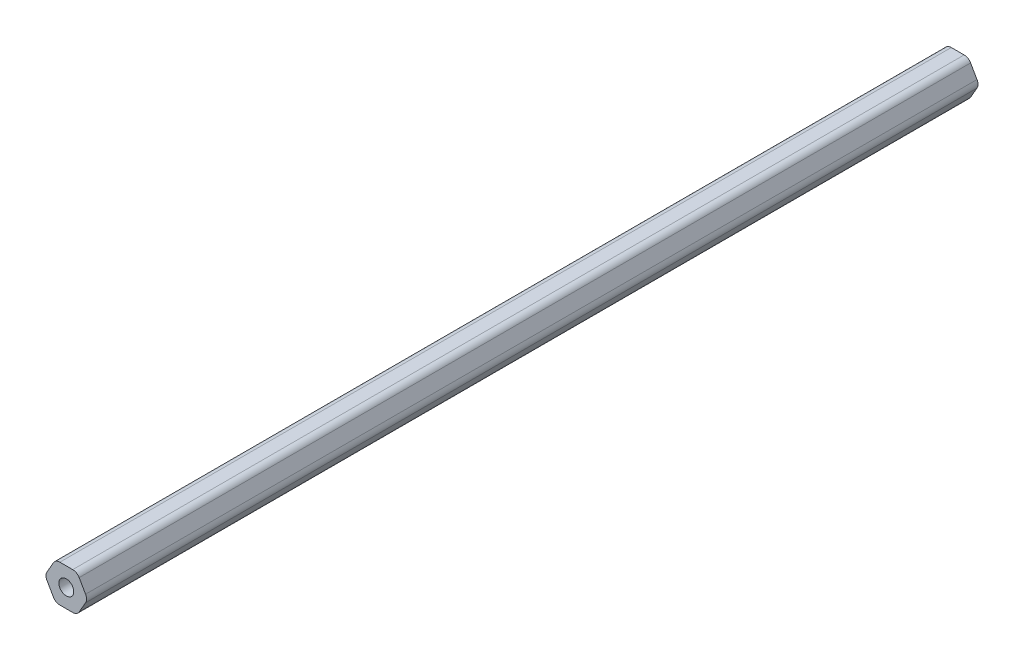
ISO-10303-21;
HEADER;
FILE_DESCRIPTION(('STEP AP214'),'2;1');
FILE_NAME('part.step','',(''),(''),'','','');
FILE_SCHEMA(('AUTOMOTIVE_DESIGN { 1 0 10303 214 1 1 1 1 }'));
ENDSEC;
DATA;
#1=APPLICATION_CONTEXT('core data for automotive mechanical design processes');
#2=APPLICATION_PROTOCOL_DEFINITION('international standard','automotive_design',2000,#1);
#3=PRODUCT_CONTEXT('',#1,'mechanical');
#4=PRODUCT('Part','Part','',(#3));
#5=PRODUCT_RELATED_PRODUCT_CATEGORY('part','',(#4));
#6=PRODUCT_DEFINITION_FORMATION('','',#4);
#7=PRODUCT_DEFINITION_CONTEXT('part definition',#1,'design');
#8=PRODUCT_DEFINITION('design','',#6,#7);
#9=PRODUCT_DEFINITION_SHAPE('','',#8);
#10=(LENGTH_UNIT() NAMED_UNIT(*) SI_UNIT(.MILLI.,.METRE.));
#11=(NAMED_UNIT(*) PLANE_ANGLE_UNIT() SI_UNIT($,.RADIAN.));
#12=(NAMED_UNIT(*) SI_UNIT($,.STERADIAN.) SOLID_ANGLE_UNIT());
#13=UNCERTAINTY_MEASURE_WITH_UNIT(LENGTH_MEASURE(1.E-05),#10,'distance_accuracy_value','');
#14=(GEOMETRIC_REPRESENTATION_CONTEXT(3) GLOBAL_UNCERTAINTY_ASSIGNED_CONTEXT((#13)) GLOBAL_UNIT_ASSIGNED_CONTEXT((#10,
#11,#12)) REPRESENTATION_CONTEXT('',''));
#15=CARTESIAN_POINT('',(0.,0.,0.));
#16=DIRECTION('',(0.,0.,1.));
#17=DIRECTION('',(1.,0.,0.));
#18=AXIS2_PLACEMENT_3D('',#15,#16,#17);
#19=CARTESIAN_POINT('',(0.,0.,304.8));
#20=DIRECTION('',(0.,0.,1.));
#21=DIRECTION('',(1.,0.,0.));
#22=AXIS2_PLACEMENT_3D('',#19,#20,#21);
#23=PLANE('',#22);
#24=DIRECTION('',(1.,0.,0.));
#25=VECTOR('',#24,1.);
#26=CARTESIAN_POINT('',(-10.0161742093541,-7.72783018867923,304.8));
#27=LINE('',#26,#25);
#28=CARTESIAN_POINT('',(-8.54970452561246,-7.72783018867923,304.8));
#29=VERTEX_POINT('',#28);
#30=CARTESIAN_POINT('',(-4.15029547438751,-7.72783018867923,304.8));
#31=VERTEX_POINT('',#30);
#32=EDGE_CURVE('E176',#29,#31,#27,.T.);
#33=ORIENTED_EDGE('',*,*,#32,.T.);
#34=CARTESIAN_POINT('',(-4.15029547438751,-5.18783018867924,304.8));
#35=DIRECTION('',(0.,0.,1.));
#36=DIRECTION('',(1.,0.,0.));
#37=AXIS2_PLACEMENT_3D('',#34,#35,#36);
#38=CIRCLE('',#37,2.54);
#39=CARTESIAN_POINT('',(-1.95059094877503,-6.45783018867924,304.8));
#40=VERTEX_POINT('',#39);
#41=EDGE_CURVE('E226',#31,#40,#38,.T.);
#42=ORIENTED_EDGE('',*,*,#41,.T.);
#43=DIRECTION('',(0.5,0.866025403784439,0.));
#44=VECTOR('',#43,1.);
#45=CARTESIAN_POINT('',(-2.68382579064586,-7.72783018867923,304.8));
#46=LINE('',#45,#44);
#47=CARTESIAN_POINT('',(0.249113576837438,-2.64783018867924,304.8));
#48=VERTEX_POINT('',#47);
#49=EDGE_CURVE('E155',#40,#48,#46,.T.);
#50=ORIENTED_EDGE('',*,*,#49,.T.);
#51=CARTESIAN_POINT('',(-1.95059094877504,-1.37783018867924,304.8));
#52=DIRECTION('',(0.,0.,1.));
#53=DIRECTION('',(1.,0.,0.));
#54=AXIS2_PLACEMENT_3D('',#51,#52,#53);
#55=CIRCLE('',#54,2.54);
#56=CARTESIAN_POINT('',(0.249113576837436,-0.107830188679235,304.8));
#57=VERTEX_POINT('',#56);
#58=EDGE_CURVE('E212',#48,#57,#55,.T.);
#59=ORIENTED_EDGE('',*,*,#58,.T.);
#60=DIRECTION('',(-0.500000000000001,0.866025403784438,0.));
#61=VECTOR('',#60,1.);
#62=CARTESIAN_POINT('',(0.982348418708263,-1.37783018867924,304.8));
#63=LINE('',#62,#61);
#64=CARTESIAN_POINT('',(-1.95059094877504,3.70216981132077,304.8));
#65=VERTEX_POINT('',#64);
#66=EDGE_CURVE('E256',#57,#65,#63,.T.);
#67=ORIENTED_EDGE('',*,*,#66,.T.);
#68=CARTESIAN_POINT('',(-4.15029547438752,2.43216981132077,304.8));
#69=DIRECTION('',(0.,0.,1.));
#70=DIRECTION('',(1.,0.,0.));
#71=AXIS2_PLACEMENT_3D('',#68,#69,#70);
#72=CIRCLE('',#71,2.54);
#73=CARTESIAN_POINT('',(-4.15029547438752,4.97216981132077,304.8));
#74=VERTEX_POINT('',#73);
#75=EDGE_CURVE('E215',#65,#74,#72,.T.);
#76=ORIENTED_EDGE('',*,*,#75,.T.);
#77=DIRECTION('',(-1.,0.,0.));
#78=VECTOR('',#77,1.);
#79=CARTESIAN_POINT('',(-2.68382579064587,4.97216981132077,304.8));
#80=LINE('',#79,#78);
#81=CARTESIAN_POINT('',(-8.54970452561246,4.97216981132076,304.8));
#82=VERTEX_POINT('',#81);
#83=EDGE_CURVE('E269',#74,#82,#80,.T.);
#84=ORIENTED_EDGE('',*,*,#83,.T.);
#85=CARTESIAN_POINT('',(-8.54970452561246,2.43216981132076,304.8));
#86=DIRECTION('',(0.,0.,1.));
#87=DIRECTION('',(1.,0.,0.));
#88=AXIS2_PLACEMENT_3D('',#85,#86,#87);
#89=CIRCLE('',#88,2.54);
#90=CARTESIAN_POINT('',(-10.7494090512249,3.70216981132076,304.8));
#91=VERTEX_POINT('',#90);
#92=EDGE_CURVE('E218',#82,#91,#89,.T.);
#93=ORIENTED_EDGE('',*,*,#92,.T.);
#94=DIRECTION('',(-0.5,-0.866025403784439,0.));
#95=VECTOR('',#94,1.);
#96=CARTESIAN_POINT('',(-10.0161742093541,4.97216981132076,304.8));
#97=LINE('',#96,#95);
#98=CARTESIAN_POINT('',(-12.9491135768374,-0.107830188679231,304.8));
#99=VERTEX_POINT('',#98);
#100=EDGE_CURVE('E272',#91,#99,#97,.T.);
#101=ORIENTED_EDGE('',*,*,#100,.T.);
#102=CARTESIAN_POINT('',(-10.7494090512249,-1.37783018867923,304.8));
#103=DIRECTION('',(0.,0.,1.));
#104=DIRECTION('',(1.,0.,0.));
#105=AXIS2_PLACEMENT_3D('',#102,#103,#104);
#106=CIRCLE('',#105,2.54);
#107=CARTESIAN_POINT('',(-12.9491135768374,-2.64783018867923,304.8));
#108=VERTEX_POINT('',#107);
#109=EDGE_CURVE('E66',#99,#108,#106,.T.);
#110=ORIENTED_EDGE('',*,*,#109,.T.);
#111=DIRECTION('',(0.5,-0.866025403784438,0.));
#112=VECTOR('',#111,1.);
#113=CARTESIAN_POINT('',(-13.6823484187082,-1.37783018867923,304.8));
#114=LINE('',#113,#112);
#115=CARTESIAN_POINT('',(-10.7494090512249,-6.45783018867923,304.8));
#116=VERTEX_POINT('',#115);
#117=EDGE_CURVE('E276',#108,#116,#114,.T.);
#118=ORIENTED_EDGE('',*,*,#117,.T.);
#119=CARTESIAN_POINT('',(-8.54970452561246,-5.18783018867923,304.8));
#120=DIRECTION('',(0.,0.,1.));
#121=DIRECTION('',(1.,0.,0.));
#122=AXIS2_PLACEMENT_3D('',#119,#120,#121);
#123=CIRCLE('',#122,2.54);
#124=EDGE_CURVE('E223',#116,#29,#123,.T.);
#125=ORIENTED_EDGE('',*,*,#124,.T.);
#126=EDGE_LOOP('',(#33,#42,#50,#59,#67,#76,#84,#93,#101,#110,#118,#125));
#127=FACE_BOUND('',#126,.T.);
#128=CARTESIAN_POINT('',(-6.34999999999999,-1.37783018867924,304.8));
#129=DIRECTION('',(0.,0.,1.));
#130=DIRECTION('',(1.,0.,0.));
#131=AXIS2_PLACEMENT_3D('',#128,#129,#130);
#132=CIRCLE('',#131,2.54);
#133=CARTESIAN_POINT('',(-8.88999999999999,-1.37783018867924,304.8));
#134=VERTEX_POINT('',#133);
#135=EDGE_CURVE('E165',#134,#134,#132,.T.);
#136=ORIENTED_EDGE('',*,*,#135,.F.);
#137=EDGE_LOOP('',(#136));
#138=FACE_BOUND('',#137,.T.);
#139=ADVANCED_FACE('F43',(#127,#138),#23,.T.);
#140=CARTESIAN_POINT('',(0.,0.,0.));
#141=DIRECTION('',(0.,0.,1.));
#142=DIRECTION('',(1.,0.,0.));
#143=AXIS2_PLACEMENT_3D('',#140,#141,#142);
#144=PLANE('',#143);
#145=DIRECTION('',(0.5,0.866025403784439,0.));
#146=VECTOR('',#145,1.);
#147=CARTESIAN_POINT('',(-2.68382579064586,-7.72783018867923,0.));
#148=LINE('',#147,#146);
#149=CARTESIAN_POINT('',(-1.95059094877503,-6.45783018867924,0.));
#150=VERTEX_POINT('',#149);
#151=CARTESIAN_POINT('',(0.249113576837438,-2.64783018867924,0.));
#152=VERTEX_POINT('',#151);
#153=EDGE_CURVE('E152',#150,#152,#148,.T.);
#154=ORIENTED_EDGE('',*,*,#153,.F.);
#155=CARTESIAN_POINT('',(-4.15029547438751,-5.18783018867924,0.));
#156=DIRECTION('',(0.,0.,1.));
#157=DIRECTION('',(1.,0.,0.));
#158=AXIS2_PLACEMENT_3D('',#155,#156,#157);
#159=CIRCLE('',#158,2.54);
#160=CARTESIAN_POINT('',(-4.15029547438751,-7.72783018867923,0.));
#161=VERTEX_POINT('',#160);
#162=EDGE_CURVE('E134',#150,#161,#159,.F.);
#163=ORIENTED_EDGE('',*,*,#162,.T.);
#164=DIRECTION('',(1.,0.,0.));
#165=VECTOR('',#164,1.);
#166=CARTESIAN_POINT('',(-10.0161742093541,-7.72783018867923,0.));
#167=LINE('',#166,#165);
#168=CARTESIAN_POINT('',(-8.54970452561246,-7.72783018867923,0.));
#169=VERTEX_POINT('',#168);
#170=EDGE_CURVE('E189',#169,#161,#167,.T.);
#171=ORIENTED_EDGE('',*,*,#170,.F.);
#172=CARTESIAN_POINT('',(-8.54970452561246,-5.18783018867923,0.));
#173=DIRECTION('',(0.,0.,1.));
#174=DIRECTION('',(1.,0.,0.));
#175=AXIS2_PLACEMENT_3D('',#172,#173,#174);
#176=CIRCLE('',#175,2.54);
#177=CARTESIAN_POINT('',(-10.7494090512249,-6.45783018867923,0.));
#178=VERTEX_POINT('',#177);
#179=EDGE_CURVE('E146',#169,#178,#176,.F.);
#180=ORIENTED_EDGE('',*,*,#179,.T.);
#181=DIRECTION('',(0.5,-0.866025403784438,0.));
#182=VECTOR('',#181,1.);
#183=CARTESIAN_POINT('',(-13.6823484187082,-1.37783018867923,0.));
#184=LINE('',#183,#182);
#185=CARTESIAN_POINT('',(-12.9491135768374,-2.64783018867923,0.));
#186=VERTEX_POINT('',#185);
#187=EDGE_CURVE('E186',#186,#178,#184,.T.);
#188=ORIENTED_EDGE('',*,*,#187,.F.);
#189=CARTESIAN_POINT('',(-10.7494090512249,-1.37783018867923,0.));
#190=DIRECTION('',(0.,0.,1.));
#191=DIRECTION('',(1.,0.,0.));
#192=AXIS2_PLACEMENT_3D('',#189,#190,#191);
#193=CIRCLE('',#192,2.54);
#194=CARTESIAN_POINT('',(-12.9491135768374,-0.107830188679231,0.));
#195=VERTEX_POINT('',#194);
#196=EDGE_CURVE('E202',#186,#195,#193,.F.);
#197=ORIENTED_EDGE('',*,*,#196,.T.);
#198=DIRECTION('',(-0.5,-0.866025403784439,0.));
#199=VECTOR('',#198,1.);
#200=CARTESIAN_POINT('',(-10.0161742093541,4.97216981132076,0.));
#201=LINE('',#200,#199);
#202=CARTESIAN_POINT('',(-10.7494090512249,3.70216981132076,0.));
#203=VERTEX_POINT('',#202);
#204=EDGE_CURVE('E182',#203,#195,#201,.T.);
#205=ORIENTED_EDGE('',*,*,#204,.F.);
#206=CARTESIAN_POINT('',(-8.54970452561246,2.43216981132076,0.));
#207=DIRECTION('',(0.,0.,1.));
#208=DIRECTION('',(1.,0.,0.));
#209=AXIS2_PLACEMENT_3D('',#206,#207,#208);
#210=CIRCLE('',#209,2.54);
#211=CARTESIAN_POINT('',(-8.54970452561246,4.97216981132076,0.));
#212=VERTEX_POINT('',#211);
#213=EDGE_CURVE('E199',#203,#212,#210,.F.);
#214=ORIENTED_EDGE('',*,*,#213,.T.);
#215=DIRECTION('',(-1.,0.,0.));
#216=VECTOR('',#215,1.);
#217=CARTESIAN_POINT('',(-2.68382579064587,4.97216981132077,0.));
#218=LINE('',#217,#216);
#219=CARTESIAN_POINT('',(-4.15029547438752,4.97216981132077,0.));
#220=VERTEX_POINT('',#219);
#221=EDGE_CURVE('E170',#220,#212,#218,.T.);
#222=ORIENTED_EDGE('',*,*,#221,.F.);
#223=CARTESIAN_POINT('',(-4.15029547438752,2.43216981132077,0.));
#224=DIRECTION('',(0.,0.,1.));
#225=DIRECTION('',(1.,0.,0.));
#226=AXIS2_PLACEMENT_3D('',#223,#224,#225);
#227=CIRCLE('',#226,2.54);
#228=CARTESIAN_POINT('',(-1.95059094877504,3.70216981132077,0.));
#229=VERTEX_POINT('',#228);
#230=EDGE_CURVE('E196',#220,#229,#227,.F.);
#231=ORIENTED_EDGE('',*,*,#230,.T.);
#232=DIRECTION('',(-0.500000000000001,0.866025403784438,0.));
#233=VECTOR('',#232,1.);
#234=CARTESIAN_POINT('',(0.982348418708263,-1.37783018867924,0.));
#235=LINE('',#234,#233);
#236=CARTESIAN_POINT('',(0.249113576837436,-0.107830188679235,0.));
#237=VERTEX_POINT('',#236);
#238=EDGE_CURVE('E164',#237,#229,#235,.T.);
#239=ORIENTED_EDGE('',*,*,#238,.F.);
#240=CARTESIAN_POINT('',(-1.95059094877504,-1.37783018867924,0.));
#241=DIRECTION('',(0.,0.,1.));
#242=DIRECTION('',(1.,0.,0.));
#243=AXIS2_PLACEMENT_3D('',#240,#241,#242);
#244=CIRCLE('',#243,2.54);
#245=EDGE_CURVE('E157',#237,#152,#244,.F.);
#246=ORIENTED_EDGE('',*,*,#245,.T.);
#247=EDGE_LOOP('',(#154,#163,#171,#180,#188,#197,#205,#214,#222,#231,#239,#246));
#248=FACE_BOUND('',#247,.T.);
#249=CARTESIAN_POINT('',(-6.34999999999999,-1.37783018867924,0.));
#250=DIRECTION('',(0.,0.,1.));
#251=DIRECTION('',(1.,0.,0.));
#252=AXIS2_PLACEMENT_3D('',#249,#250,#251);
#253=CIRCLE('',#252,2.54);
#254=CARTESIAN_POINT('',(-8.88999999999999,-1.37783018867924,0.));
#255=VERTEX_POINT('',#254);
#256=EDGE_CURVE('E173',#255,#255,#253,.T.);
#257=ORIENTED_EDGE('',*,*,#256,.T.);
#258=EDGE_LOOP('',(#257));
#259=FACE_BOUND('',#258,.T.);
#260=ADVANCED_FACE('F160',(#248,#259),#144,.F.);
#261=CARTESIAN_POINT('',(-2.68382579064586,-7.72783018867923,304.8));
#262=DIRECTION('',(-0.866025403784439,0.5,0.));
#263=DIRECTION('',(-0.5,-0.866025403784439,0.));
#264=AXIS2_PLACEMENT_3D('',#261,#262,#263);
#265=PLANE('',#264);
#266=ORIENTED_EDGE('',*,*,#49,.F.);
#267=DIRECTION('',(0.,0.,-1.));
#268=VECTOR('',#267,1.);
#269=CARTESIAN_POINT('',(-1.95059094877503,-6.45783018867924,304.8));
#270=LINE('',#269,#268);
#271=EDGE_CURVE('E138',#40,#150,#270,.T.);
#272=ORIENTED_EDGE('',*,*,#271,.T.);
#273=ORIENTED_EDGE('',*,*,#153,.T.);
#274=DIRECTION('',(0.,0.,-1.));
#275=VECTOR('',#274,1.);
#276=CARTESIAN_POINT('',(0.249113576837438,-2.64783018867923,304.8));
#277=LINE('',#276,#275);
#278=EDGE_CURVE('E158',#152,#48,#277,.F.);
#279=ORIENTED_EDGE('',*,*,#278,.T.);
#280=EDGE_LOOP('',(#266,#272,#273,#279));
#281=FACE_BOUND('',#280,.T.);
#282=ADVANCED_FACE('F151',(#281),#265,.F.);
#283=CARTESIAN_POINT('',(0.982348418708263,-1.37783018867924,304.8));
#284=DIRECTION('',(-0.866025403784438,-0.500000000000001,0.));
#285=DIRECTION('',(0.500000000000001,-0.866025403784438,0.));
#286=AXIS2_PLACEMENT_3D('',#283,#284,#285);
#287=PLANE('',#286);
#288=ORIENTED_EDGE('',*,*,#238,.T.);
#289=DIRECTION('',(0.,0.,-1.));
#290=VECTOR('',#289,1.);
#291=CARTESIAN_POINT('',(-1.95059094877504,3.70216981132077,304.8));
#292=LINE('',#291,#290);
#293=EDGE_CURVE('E11',#229,#65,#292,.F.);
#294=ORIENTED_EDGE('',*,*,#293,.T.);
#295=ORIENTED_EDGE('',*,*,#66,.F.);
#296=DIRECTION('',(0.,0.,-1.));
#297=VECTOR('',#296,1.);
#298=CARTESIAN_POINT('',(0.249113576837436,-0.107830188679235,304.8));
#299=LINE('',#298,#297);
#300=EDGE_CURVE('E52',#57,#237,#299,.T.);
#301=ORIENTED_EDGE('',*,*,#300,.T.);
#302=EDGE_LOOP('',(#288,#294,#295,#301));
#303=FACE_BOUND('',#302,.T.);
#304=ADVANCED_FACE('F253',(#303),#287,.F.);
#305=CARTESIAN_POINT('',(-2.68382579064587,4.97216981132077,304.8));
#306=DIRECTION('',(0.,-1.,0.));
#307=DIRECTION('',(1.,0.,0.));
#308=AXIS2_PLACEMENT_3D('',#305,#306,#307);
#309=PLANE('',#308);
#310=ORIENTED_EDGE('',*,*,#221,.T.);
#311=DIRECTION('',(0.,0.,-1.));
#312=VECTOR('',#311,1.);
#313=CARTESIAN_POINT('',(-8.54970452561246,4.97216981132076,304.8));
#314=LINE('',#313,#312);
#315=EDGE_CURVE('E246',#212,#82,#314,.F.);
#316=ORIENTED_EDGE('',*,*,#315,.T.);
#317=ORIENTED_EDGE('',*,*,#83,.F.);
#318=DIRECTION('',(0.,0.,-1.));
#319=VECTOR('',#318,1.);
#320=CARTESIAN_POINT('',(-4.15029547438752,4.97216981132077,304.8));
#321=LINE('',#320,#319);
#322=EDGE_CURVE('E242',#74,#220,#321,.T.);
#323=ORIENTED_EDGE('',*,*,#322,.T.);
#324=EDGE_LOOP('',(#310,#316,#317,#323));
#325=FACE_BOUND('',#324,.T.);
#326=ADVANCED_FACE('F266',(#325),#309,.F.);
#327=CARTESIAN_POINT('',(-10.0161742093541,4.97216981132076,304.8));
#328=DIRECTION('',(0.866025403784439,-0.5,0.));
#329=DIRECTION('',(0.5,0.866025403784439,0.));
#330=AXIS2_PLACEMENT_3D('',#327,#328,#329);
#331=PLANE('',#330);
#332=ORIENTED_EDGE('',*,*,#204,.T.);
#333=DIRECTION('',(0.,0.,-1.));
#334=VECTOR('',#333,1.);
#335=CARTESIAN_POINT('',(-12.9491135768374,-0.107830188679232,304.8));
#336=LINE('',#335,#334);
#337=EDGE_CURVE('E239',#195,#99,#336,.F.);
#338=ORIENTED_EDGE('',*,*,#337,.T.);
#339=ORIENTED_EDGE('',*,*,#100,.F.);
#340=DIRECTION('',(0.,0.,-1.));
#341=VECTOR('',#340,1.);
#342=CARTESIAN_POINT('',(-10.7494090512249,3.70216981132076,304.8));
#343=LINE('',#342,#341);
#344=EDGE_CURVE('E235',#91,#203,#343,.T.);
#345=ORIENTED_EDGE('',*,*,#344,.T.);
#346=EDGE_LOOP('',(#332,#338,#339,#345));
#347=FACE_BOUND('',#346,.T.);
#348=ADVANCED_FACE('F299',(#347),#331,.F.);
#349=CARTESIAN_POINT('',(-13.6823484187082,-1.37783018867923,304.8));
#350=DIRECTION('',(0.866025403784439,0.5,0.));
#351=DIRECTION('',(-0.5,0.866025403784438,0.));
#352=AXIS2_PLACEMENT_3D('',#349,#350,#351);
#353=PLANE('',#352);
#354=ORIENTED_EDGE('',*,*,#187,.T.);
#355=DIRECTION('',(0.,0.,-1.));
#356=VECTOR('',#355,1.);
#357=CARTESIAN_POINT('',(-10.7494090512249,-6.45783018867924,304.8));
#358=LINE('',#357,#356);
#359=EDGE_CURVE('E59',#178,#116,#358,.F.);
#360=ORIENTED_EDGE('',*,*,#359,.T.);
#361=ORIENTED_EDGE('',*,*,#117,.F.);
#362=DIRECTION('',(0.,0.,-1.));
#363=VECTOR('',#362,1.);
#364=CARTESIAN_POINT('',(-12.9491135768374,-2.64783018867923,304.8));
#365=LINE('',#364,#363);
#366=EDGE_CURVE('E229',#108,#186,#365,.T.);
#367=ORIENTED_EDGE('',*,*,#366,.T.);
#368=EDGE_LOOP('',(#354,#360,#361,#367));
#369=FACE_BOUND('',#368,.T.);
#370=ADVANCED_FACE('F292',(#369),#353,.F.);
#371=CARTESIAN_POINT('',(-10.0161742093541,-7.72783018867923,304.8));
#372=DIRECTION('',(0.,1.,0.));
#373=DIRECTION('',(-1.,0.,0.));
#374=AXIS2_PLACEMENT_3D('',#371,#372,#373);
#375=PLANE('',#374);
#376=ORIENTED_EDGE('',*,*,#170,.T.);
#377=DIRECTION('',(0.,0.,-1.));
#378=VECTOR('',#377,1.);
#379=CARTESIAN_POINT('',(-4.15029547438751,-7.72783018867923,304.8));
#380=LINE('',#379,#378);
#381=EDGE_CURVE('E139',#161,#31,#380,.F.);
#382=ORIENTED_EDGE('',*,*,#381,.T.);
#383=ORIENTED_EDGE('',*,*,#32,.F.);
#384=DIRECTION('',(0.,0.,-1.));
#385=VECTOR('',#384,1.);
#386=CARTESIAN_POINT('',(-8.54970452561246,-7.72783018867923,304.8));
#387=LINE('',#386,#385);
#388=EDGE_CURVE('E145',#29,#169,#387,.T.);
#389=ORIENTED_EDGE('',*,*,#388,.T.);
#390=EDGE_LOOP('',(#376,#382,#383,#389));
#391=FACE_BOUND('',#390,.T.);
#392=ADVANCED_FACE('F288',(#391),#375,.F.);
#393=CARTESIAN_POINT('',(-6.34999999999999,-1.37783018867924,304.8));
#394=DIRECTION('',(0.,0.,-1.));
#395=DIRECTION('',(-1.,0.,0.));
#396=AXIS2_PLACEMENT_3D('',#393,#394,#395);
#397=CYLINDRICAL_SURFACE('',#396,2.54);
#398=CARTESIAN_POINT('',(-8.88999999999999,-1.37783018867924,304.8));
#399=CARTESIAN_POINT('',(-8.88999999999999,-1.37783018867924,301.625));
#400=CARTESIAN_POINT('',(-8.88999999999999,-1.37783018867924,298.45));
#401=CARTESIAN_POINT('',(-8.88999999999999,-1.37783018867924,292.1));
#402=CARTESIAN_POINT('',(-8.88999999999999,-1.37783018867924,288.925));
#403=CARTESIAN_POINT('',(-8.88999999999999,-1.37783018867924,282.575));
#404=CARTESIAN_POINT('',(-8.88999999999999,-1.37783018867924,279.4));
#405=CARTESIAN_POINT('',(-8.88999999999999,-1.37783018867924,273.05));
#406=CARTESIAN_POINT('',(-8.88999999999999,-1.37783018867924,269.875));
#407=CARTESIAN_POINT('',(-8.88999999999999,-1.37783018867924,263.525));
#408=CARTESIAN_POINT('',(-8.88999999999999,-1.37783018867924,260.35));
#409=CARTESIAN_POINT('',(-8.88999999999999,-1.37783018867924,254.));
#410=CARTESIAN_POINT('',(-8.88999999999999,-1.37783018867924,250.825));
#411=CARTESIAN_POINT('',(-8.88999999999999,-1.37783018867924,244.475));
#412=CARTESIAN_POINT('',(-8.88999999999999,-1.37783018867924,241.3));
#413=CARTESIAN_POINT('',(-8.88999999999999,-1.37783018867924,234.95));
#414=CARTESIAN_POINT('',(-8.88999999999999,-1.37783018867924,231.775));
#415=CARTESIAN_POINT('',(-8.88999999999999,-1.37783018867924,225.425));
#416=CARTESIAN_POINT('',(-8.88999999999999,-1.37783018867924,222.25));
#417=CARTESIAN_POINT('',(-8.88999999999999,-1.37783018867924,215.9));
#418=CARTESIAN_POINT('',(-8.88999999999999,-1.37783018867924,212.725));
#419=CARTESIAN_POINT('',(-8.88999999999999,-1.37783018867924,206.375));
#420=CARTESIAN_POINT('',(-8.88999999999999,-1.37783018867924,203.2));
#421=CARTESIAN_POINT('',(-8.88999999999999,-1.37783018867924,196.85));
#422=CARTESIAN_POINT('',(-8.88999999999999,-1.37783018867924,193.675));
#423=CARTESIAN_POINT('',(-8.88999999999999,-1.37783018867924,187.325));
#424=CARTESIAN_POINT('',(-8.88999999999999,-1.37783018867924,184.15));
#425=CARTESIAN_POINT('',(-8.88999999999999,-1.37783018867924,177.8));
#426=CARTESIAN_POINT('',(-8.88999999999999,-1.37783018867924,174.625));
#427=CARTESIAN_POINT('',(-8.88999999999999,-1.37783018867924,168.275));
#428=CARTESIAN_POINT('',(-8.88999999999999,-1.37783018867924,165.1));
#429=CARTESIAN_POINT('',(-8.88999999999999,-1.37783018867924,158.75));
#430=CARTESIAN_POINT('',(-8.88999999999999,-1.37783018867924,155.575));
#431=CARTESIAN_POINT('',(-8.88999999999999,-1.37783018867924,149.225));
#432=CARTESIAN_POINT('',(-8.88999999999999,-1.37783018867924,146.05));
#433=CARTESIAN_POINT('',(-8.88999999999999,-1.37783018867924,139.7));
#434=CARTESIAN_POINT('',(-8.88999999999999,-1.37783018867924,136.525));
#435=CARTESIAN_POINT('',(-8.88999999999999,-1.37783018867924,130.175));
#436=CARTESIAN_POINT('',(-8.88999999999999,-1.37783018867924,127.));
#437=CARTESIAN_POINT('',(-8.88999999999999,-1.37783018867924,120.65));
#438=CARTESIAN_POINT('',(-8.88999999999999,-1.37783018867924,117.475));
#439=CARTESIAN_POINT('',(-8.88999999999999,-1.37783018867924,111.125));
#440=CARTESIAN_POINT('',(-8.88999999999999,-1.37783018867924,107.95));
#441=CARTESIAN_POINT('',(-8.88999999999999,-1.37783018867924,101.6));
#442=CARTESIAN_POINT('',(-8.88999999999999,-1.37783018867924,98.425));
#443=CARTESIAN_POINT('',(-8.88999999999999,-1.37783018867924,92.075));
#444=CARTESIAN_POINT('',(-8.88999999999999,-1.37783018867924,88.9));
#445=CARTESIAN_POINT('',(-8.88999999999999,-1.37783018867924,82.55));
#446=CARTESIAN_POINT('',(-8.88999999999999,-1.37783018867924,79.375));
#447=CARTESIAN_POINT('',(-8.88999999999999,-1.37783018867924,73.025));
#448=CARTESIAN_POINT('',(-8.88999999999999,-1.37783018867924,69.85));
#449=CARTESIAN_POINT('',(-8.88999999999999,-1.37783018867924,63.5));
#450=CARTESIAN_POINT('',(-8.88999999999999,-1.37783018867924,60.325));
#451=CARTESIAN_POINT('',(-8.88999999999999,-1.37783018867924,53.975));
#452=CARTESIAN_POINT('',(-8.88999999999999,-1.37783018867924,50.8));
#453=CARTESIAN_POINT('',(-8.88999999999999,-1.37783018867924,44.45));
#454=CARTESIAN_POINT('',(-8.88999999999999,-1.37783018867924,41.275));
#455=CARTESIAN_POINT('',(-8.88999999999999,-1.37783018867924,34.925));
#456=CARTESIAN_POINT('',(-8.88999999999999,-1.37783018867924,31.75));
#457=CARTESIAN_POINT('',(-8.88999999999999,-1.37783018867924,25.4));
#458=CARTESIAN_POINT('',(-8.88999999999999,-1.37783018867924,22.225));
#459=CARTESIAN_POINT('',(-8.88999999999999,-1.37783018867924,15.875));
#460=CARTESIAN_POINT('',(-8.88999999999999,-1.37783018867924,12.7));
#461=CARTESIAN_POINT('',(-8.88999999999999,-1.37783018867924,6.35));
#462=CARTESIAN_POINT('',(-8.88999999999999,-1.37783018867924,3.175));
#463=CARTESIAN_POINT('',(-8.88999999999999,-1.37783018867924,0.));
#464=B_SPLINE_CURVE_WITH_KNOTS('',3,(#398,#399,#400,#401,#402,#403,#404,#405,#406,#407,#408,
#409,#410,#411,#412,#413,#414,#415,#416,#417,#418,#419,#420,#421,#422,#423,#424,#425,#426,#427,
#428,#429,#430,#431,#432,#433,#434,#435,#436,#437,#438,#439,#440,#441,#442,#443,#444,#445,#446,
#447,#448,#449,#450,#451,#452,#453,#454,#455,#456,#457,#458,#459,#460,#461,#462,#463),
.UNSPECIFIED.,.F.,.F.,(4,2,2,2,2,2,2,2,2,2,2,2,2,2,2,2,2,2,2,2,2,2,2,2,2,2,2,2,2,2,2,2,4),(0.,
9.52500000000001,19.05,28.575,38.1,47.625,57.15,66.675,76.2,85.7250000000001,95.2500000000001,
104.775,114.3,123.825,133.35,142.875,152.4,161.925,171.45,180.975,190.5,200.025,209.55,219.075,
228.6,238.125,247.65,257.175,266.7,276.225,285.75,295.275,304.8),.UNSPECIFIED.);
#465=EDGE_CURVE('BSEAM318',#134,#255,#464,.T.);
#466=ORIENTED_EDGE('',*,*,#135,.T.);
#467=ORIENTED_EDGE('',*,*,#256,.F.);
#468=ORIENTED_EDGE('',*,*,#465,.T.);
#469=ORIENTED_EDGE('',*,*,#465,.F.);
#470=EDGE_LOOP('',(#466,#468,#467,#469));
#471=FACE_BOUND('',#470,.T.);
#472=ADVANCED_FACE('F318',(#471),#397,.F.);
#473=CARTESIAN_POINT('',(-4.15029547438751,-5.18783018867924,304.8));
#474=DIRECTION('',(0.,0.,-1.));
#475=DIRECTION('',(-1.,0.,0.));
#476=AXIS2_PLACEMENT_3D('',#473,#474,#475);
#477=CYLINDRICAL_SURFACE('',#476,2.54);
#478=ORIENTED_EDGE('',*,*,#41,.F.);
#479=ORIENTED_EDGE('',*,*,#381,.F.);
#480=ORIENTED_EDGE('',*,*,#162,.F.);
#481=ORIENTED_EDGE('',*,*,#271,.F.);
#482=EDGE_LOOP('',(#478,#479,#480,#481));
#483=FACE_BOUND('',#482,.T.);
#484=ADVANCED_FACE('F137',(#483),#477,.T.);
#485=CARTESIAN_POINT('',(-8.54970452561246,-5.18783018867923,304.8));
#486=DIRECTION('',(0.,0.,-1.));
#487=DIRECTION('',(-1.,0.,0.));
#488=AXIS2_PLACEMENT_3D('',#485,#486,#487);
#489=CYLINDRICAL_SURFACE('',#488,2.54);
#490=ORIENTED_EDGE('',*,*,#124,.F.);
#491=ORIENTED_EDGE('',*,*,#359,.F.);
#492=ORIENTED_EDGE('',*,*,#179,.F.);
#493=ORIENTED_EDGE('',*,*,#388,.F.);
#494=EDGE_LOOP('',(#490,#491,#492,#493));
#495=FACE_BOUND('',#494,.T.);
#496=ADVANCED_FACE('F290',(#495),#489,.T.);
#497=CARTESIAN_POINT('',(-10.7494090512249,-1.37783018867923,304.8));
#498=DIRECTION('',(0.,0.,-1.));
#499=DIRECTION('',(-1.,0.,0.));
#500=AXIS2_PLACEMENT_3D('',#497,#498,#499);
#501=CYLINDRICAL_SURFACE('',#500,2.54);
#502=ORIENTED_EDGE('',*,*,#109,.F.);
#503=ORIENTED_EDGE('',*,*,#337,.F.);
#504=ORIENTED_EDGE('',*,*,#196,.F.);
#505=ORIENTED_EDGE('',*,*,#366,.F.);
#506=EDGE_LOOP('',(#502,#503,#504,#505));
#507=FACE_BOUND('',#506,.T.);
#508=ADVANCED_FACE('F295',(#507),#501,.T.);
#509=CARTESIAN_POINT('',(-8.54970452561246,2.43216981132076,304.8));
#510=DIRECTION('',(0.,0.,-1.));
#511=DIRECTION('',(-1.,0.,0.));
#512=AXIS2_PLACEMENT_3D('',#509,#510,#511);
#513=CYLINDRICAL_SURFACE('',#512,2.54);
#514=ORIENTED_EDGE('',*,*,#92,.F.);
#515=ORIENTED_EDGE('',*,*,#315,.F.);
#516=ORIENTED_EDGE('',*,*,#213,.F.);
#517=ORIENTED_EDGE('',*,*,#344,.F.);
#518=EDGE_LOOP('',(#514,#515,#516,#517));
#519=FACE_BOUND('',#518,.T.);
#520=ADVANCED_FACE('F303',(#519),#513,.T.);
#521=CARTESIAN_POINT('',(-4.15029547438752,2.43216981132077,304.8));
#522=DIRECTION('',(0.,0.,-1.));
#523=DIRECTION('',(-1.,0.,0.));
#524=AXIS2_PLACEMENT_3D('',#521,#522,#523);
#525=CYLINDRICAL_SURFACE('',#524,2.54);
#526=ORIENTED_EDGE('',*,*,#75,.F.);
#527=ORIENTED_EDGE('',*,*,#293,.F.);
#528=ORIENTED_EDGE('',*,*,#230,.F.);
#529=ORIENTED_EDGE('',*,*,#322,.F.);
#530=EDGE_LOOP('',(#526,#527,#528,#529));
#531=FACE_BOUND('',#530,.T.);
#532=ADVANCED_FACE('F263',(#531),#525,.T.);
#533=CARTESIAN_POINT('',(-1.95059094877504,-1.37783018867924,304.8));
#534=DIRECTION('',(0.,0.,-1.));
#535=DIRECTION('',(-1.,0.,0.));
#536=AXIS2_PLACEMENT_3D('',#533,#534,#535);
#537=CYLINDRICAL_SURFACE('',#536,2.54);
#538=ORIENTED_EDGE('',*,*,#58,.F.);
#539=ORIENTED_EDGE('',*,*,#278,.F.);
#540=ORIENTED_EDGE('',*,*,#245,.F.);
#541=ORIENTED_EDGE('',*,*,#300,.F.);
#542=EDGE_LOOP('',(#538,#539,#540,#541));
#543=FACE_BOUND('',#542,.T.);
#544=ADVANCED_FACE('F45',(#543),#537,.T.);
#545=CLOSED_SHELL('',(#139,#260,#282,#304,#326,#348,#370,#392,#472,#484,#496,#508,#520,#532,#544));
#546=MANIFOLD_SOLID_BREP('B2',#545);
#547=ADVANCED_BREP_SHAPE_REPRESENTATION('',(#18,#546),#14);
#548=SHAPE_DEFINITION_REPRESENTATION(#9,#547);
ENDSEC;
END-ISO-10303-21;
